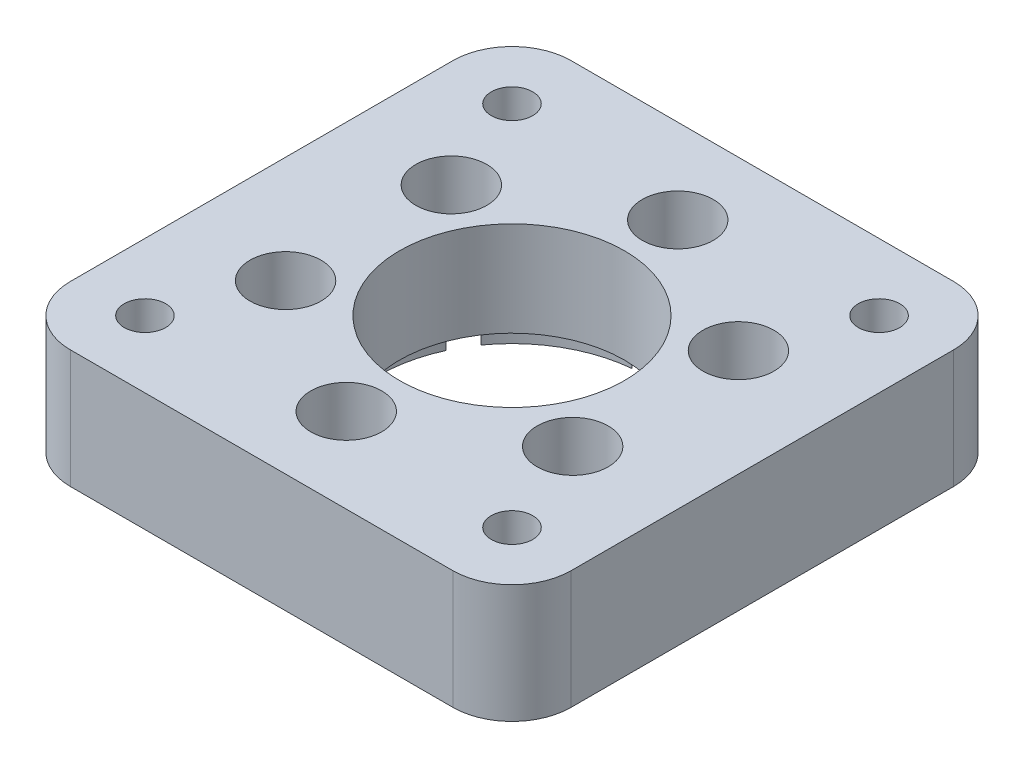
ISO-10303-21;
HEADER;
FILE_DESCRIPTION(('STEP AP214'),'2;1');
FILE_NAME('part.step','',(''),(''),'','','');
FILE_SCHEMA(('AUTOMOTIVE_DESIGN { 1 0 10303 214 1 1 1 1 }'));
ENDSEC;
DATA;
#1=APPLICATION_CONTEXT('core data for automotive mechanical design processes');
#2=APPLICATION_PROTOCOL_DEFINITION('international standard','automotive_design',2000,#1);
#3=PRODUCT_CONTEXT('',#1,'mechanical');
#4=PRODUCT('Part','Part','',(#3));
#5=PRODUCT_RELATED_PRODUCT_CATEGORY('part','',(#4));
#6=PRODUCT_DEFINITION_FORMATION('','',#4);
#7=PRODUCT_DEFINITION_CONTEXT('part definition',#1,'design');
#8=PRODUCT_DEFINITION('design','',#6,#7);
#9=PRODUCT_DEFINITION_SHAPE('','',#8);
#10=(LENGTH_UNIT() NAMED_UNIT(*) SI_UNIT(.MILLI.,.METRE.));
#11=(NAMED_UNIT(*) PLANE_ANGLE_UNIT() SI_UNIT($,.RADIAN.));
#12=(NAMED_UNIT(*) SI_UNIT($,.STERADIAN.) SOLID_ANGLE_UNIT());
#13=UNCERTAINTY_MEASURE_WITH_UNIT(LENGTH_MEASURE(1.E-05),#10,'distance_accuracy_value','');
#14=(GEOMETRIC_REPRESENTATION_CONTEXT(3) GLOBAL_UNCERTAINTY_ASSIGNED_CONTEXT((#13)) GLOBAL_UNIT_ASSIGNED_CONTEXT((#10,
#11,#12)) REPRESENTATION_CONTEXT('',''));
#15=CARTESIAN_POINT('',(0.,0.,0.));
#16=DIRECTION('',(0.,0.,1.));
#17=DIRECTION('',(1.,0.,0.));
#18=AXIS2_PLACEMENT_3D('',#15,#16,#17);
#19=CARTESIAN_POINT('',(0.,-3.,0.));
#20=DIRECTION('',(0.,-1.,0.));
#21=DIRECTION('',(0.,0.,-1.));
#22=AXIS2_PLACEMENT_3D('',#19,#20,#21);
#23=CYLINDRICAL_SURFACE('',#22,11.25);
#24=CARTESIAN_POINT('',(0.,-3.,0.));
#25=DIRECTION('',(0.,-1.,0.));
#26=DIRECTION('',(0.,0.,-1.));
#27=AXIS2_PLACEMENT_3D('',#24,#25,#26);
#28=CIRCLE('',#27,11.25);
#29=CARTESIAN_POINT('',(-9.16155232079619,-3.,-6.52904733275185));
#30=VERTEX_POINT('',#29);
#31=CARTESIAN_POINT('',(-1.07354469227591,-3.,-11.1986607142857));
#32=VERTEX_POINT('',#31);
#33=EDGE_CURVE('E184',#30,#32,#28,.T.);
#34=ORIENTED_EDGE('',*,*,#33,.F.);
#35=DIRECTION('',(0.,1.,0.));
#36=VECTOR('',#35,1.);
#37=CARTESIAN_POINT('',(-9.16155232079618,0.,-6.52904733275185));
#38=LINE('',#37,#36);
#39=CARTESIAN_POINT('',(-9.16155232079619,-5.,-6.52904733275185));
#40=VERTEX_POINT('',#39);
#41=EDGE_CURVE('E49',#30,#40,#38,.F.);
#42=ORIENTED_EDGE('',*,*,#41,.T.);
#43=CARTESIAN_POINT('',(0.,-5.,0.));
#44=DIRECTION('',(0.,-1.,0.));
#45=DIRECTION('',(0.,0.,-1.));
#46=AXIS2_PLACEMENT_3D('',#43,#44,#45);
#47=CIRCLE('',#46,11.25);
#48=CARTESIAN_POINT('',(-1.07354469227591,-5.,-11.1986607142857));
#49=VERTEX_POINT('',#48);
#50=EDGE_CURVE('E182',#40,#49,#47,.T.);
#51=ORIENTED_EDGE('',*,*,#50,.T.);
#52=DIRECTION('',(0.,1.,0.));
#53=VECTOR('',#52,1.);
#54=CARTESIAN_POINT('',(-1.07354469227591,0.,-11.1986607142857));
#55=LINE('',#54,#53);
#56=EDGE_CURVE('E270',#49,#32,#55,.T.);
#57=ORIENTED_EDGE('',*,*,#56,.T.);
#58=EDGE_LOOP('',(#34,#42,#51,#57));
#59=FACE_BOUND('',#58,.T.);
#60=ADVANCED_FACE('F35',(#59),#23,.F.);
#61=CARTESIAN_POINT('',(-10.2350970130722,-5.,4.66961338153388));
#62=VERTEX_POINT('',#61);
#63=CARTESIAN_POINT('',(-10.2350970130721,-5.,-4.66961338153409));
#64=VERTEX_POINT('',#63);
#65=EDGE_CURVE('E192',#62,#64,#47,.T.);
#66=ORIENTED_EDGE('',*,*,#65,.T.);
#67=DIRECTION('',(0.,1.,0.));
#68=VECTOR('',#67,1.);
#69=CARTESIAN_POINT('',(-10.2350970130721,0.,-4.66961338153409));
#70=LINE('',#69,#68);
#71=CARTESIAN_POINT('',(-10.2350970130721,-3.,-4.66961338153409));
#72=VERTEX_POINT('',#71);
#73=EDGE_CURVE('E172',#64,#72,#70,.T.);
#74=ORIENTED_EDGE('',*,*,#73,.T.);
#75=CARTESIAN_POINT('',(-10.2350970130722,-3.,4.66961338153388));
#76=VERTEX_POINT('',#75);
#77=EDGE_CURVE('E207',#76,#72,#28,.T.);
#78=ORIENTED_EDGE('',*,*,#77,.F.);
#79=DIRECTION('',(0.,1.,0.));
#80=VECTOR('',#79,1.);
#81=CARTESIAN_POINT('',(-10.2350970130722,0.,4.66961338153388));
#82=LINE('',#81,#80);
#83=EDGE_CURVE('E57',#76,#62,#82,.F.);
#84=ORIENTED_EDGE('',*,*,#83,.T.);
#85=EDGE_LOOP('',(#66,#74,#78,#84));
#86=FACE_BOUND('',#85,.T.);
#87=ADVANCED_FACE('F300',(#86),#23,.F.);
#88=CARTESIAN_POINT('',(-1.07354469227591,-5.,11.1986607142857));
#89=VERTEX_POINT('',#88);
#90=CARTESIAN_POINT('',(-9.16155232079632,-5.,6.52904733275166));
#91=VERTEX_POINT('',#90);
#92=EDGE_CURVE('E196',#89,#91,#47,.T.);
#93=ORIENTED_EDGE('',*,*,#92,.T.);
#94=DIRECTION('',(0.,1.,0.));
#95=VECTOR('',#94,1.);
#96=CARTESIAN_POINT('',(-9.16155232079632,0.,6.52904733275166));
#97=LINE('',#96,#95);
#98=CARTESIAN_POINT('',(-9.16155232079632,-3.,6.52904733275166));
#99=VERTEX_POINT('',#98);
#100=EDGE_CURVE('E227',#91,#99,#97,.T.);
#101=ORIENTED_EDGE('',*,*,#100,.T.);
#102=CARTESIAN_POINT('',(-1.07354469227591,-3.,11.1986607142857));
#103=VERTEX_POINT('',#102);
#104=EDGE_CURVE('E292',#103,#99,#28,.T.);
#105=ORIENTED_EDGE('',*,*,#104,.F.);
#106=DIRECTION('',(0.,1.,0.));
#107=VECTOR('',#106,1.);
#108=CARTESIAN_POINT('',(-1.07354469227591,0.,11.1986607142857));
#109=LINE('',#108,#107);
#110=EDGE_CURVE('E229',#103,#89,#109,.F.);
#111=ORIENTED_EDGE('',*,*,#110,.T.);
#112=EDGE_LOOP('',(#93,#101,#105,#111));
#113=FACE_BOUND('',#112,.T.);
#114=ADVANCED_FACE('F225',(#113),#23,.F.);
#115=CARTESIAN_POINT('',(9.16155232079623,-5.,6.52904733275177));
#116=VERTEX_POINT('',#115);
#117=CARTESIAN_POINT('',(1.07354469227591,-5.,11.1986607142857));
#118=VERTEX_POINT('',#117);
#119=EDGE_CURVE('E210',#116,#118,#47,.T.);
#120=ORIENTED_EDGE('',*,*,#119,.T.);
#121=DIRECTION('',(0.,1.,0.));
#122=VECTOR('',#121,1.);
#123=CARTESIAN_POINT('',(1.07354469227591,0.,11.1986607142857));
#124=LINE('',#123,#122);
#125=CARTESIAN_POINT('',(1.07354469227591,-3.,11.1986607142857));
#126=VERTEX_POINT('',#125);
#127=EDGE_CURVE('E243',#118,#126,#124,.T.);
#128=ORIENTED_EDGE('',*,*,#127,.T.);
#129=CARTESIAN_POINT('',(9.16155232079624,-3.,6.52904733275177));
#130=VERTEX_POINT('',#129);
#131=EDGE_CURVE('E288',#130,#126,#28,.T.);
#132=ORIENTED_EDGE('',*,*,#131,.F.);
#133=DIRECTION('',(0.,1.,0.));
#134=VECTOR('',#133,1.);
#135=CARTESIAN_POINT('',(9.16155232079623,0.,6.52904733275177));
#136=LINE('',#135,#134);
#137=EDGE_CURVE('E256',#130,#116,#136,.F.);
#138=ORIENTED_EDGE('',*,*,#137,.T.);
#139=EDGE_LOOP('',(#120,#128,#132,#138));
#140=FACE_BOUND('',#139,.T.);
#141=ADVANCED_FACE('F417',(#140),#23,.F.);
#142=CARTESIAN_POINT('',(10.2350970130722,-5.,-4.66961338153395));
#143=VERTEX_POINT('',#142);
#144=CARTESIAN_POINT('',(10.2350970130721,-5.,4.66961338153403));
#145=VERTEX_POINT('',#144);
#146=EDGE_CURVE('E203',#143,#145,#47,.T.);
#147=ORIENTED_EDGE('',*,*,#146,.T.);
#148=DIRECTION('',(0.,1.,0.));
#149=VECTOR('',#148,1.);
#150=CARTESIAN_POINT('',(10.2350970130721,0.,4.66961338153403));
#151=LINE('',#150,#149);
#152=CARTESIAN_POINT('',(10.2350970130721,-3.,4.66961338153403));
#153=VERTEX_POINT('',#152);
#154=EDGE_CURVE('E252',#145,#153,#151,.T.);
#155=ORIENTED_EDGE('',*,*,#154,.T.);
#156=CARTESIAN_POINT('',(10.2350970130722,-3.,-4.66961338153395));
#157=VERTEX_POINT('',#156);
#158=EDGE_CURVE('E279',#157,#153,#28,.T.);
#159=ORIENTED_EDGE('',*,*,#158,.F.);
#160=DIRECTION('',(0.,1.,0.));
#161=VECTOR('',#160,1.);
#162=CARTESIAN_POINT('',(10.2350970130722,0.,-4.66961338153395));
#163=LINE('',#162,#161);
#164=EDGE_CURVE('E266',#157,#143,#163,.F.);
#165=ORIENTED_EDGE('',*,*,#164,.T.);
#166=EDGE_LOOP('',(#147,#155,#159,#165));
#167=FACE_BOUND('',#166,.T.);
#168=ADVANCED_FACE('F407',(#167),#23,.F.);
#169=CARTESIAN_POINT('',(21.15,5.,-21.15));
#170=DIRECTION('',(-1.,0.,0.));
#171=DIRECTION('',(0.,0.,1.));
#172=AXIS2_PLACEMENT_3D('',#169,#170,#171);
#173=PLANE('',#172);
#174=DIRECTION('',(0.,0.,-1.));
#175=VECTOR('',#174,1.);
#176=CARTESIAN_POINT('',(21.15,-5.,-21.15));
#177=LINE('',#176,#175);
#178=CARTESIAN_POINT('',(21.15,-5.,16.15));
#179=VERTEX_POINT('',#178);
#180=CARTESIAN_POINT('',(21.15,-5.,-16.15));
#181=VERTEX_POINT('',#180);
#182=EDGE_CURVE('E645',#179,#181,#177,.T.);
#183=ORIENTED_EDGE('',*,*,#182,.T.);
#184=DIRECTION('',(0.,-1.,0.));
#185=VECTOR('',#184,1.);
#186=CARTESIAN_POINT('',(21.15,5.,-16.15));
#187=LINE('',#186,#185);
#188=CARTESIAN_POINT('',(21.15,5.,-16.15));
#189=VERTEX_POINT('',#188);
#190=EDGE_CURVE('E374',#181,#189,#187,.F.);
#191=ORIENTED_EDGE('',*,*,#190,.T.);
#192=DIRECTION('',(0.,0.,-1.));
#193=VECTOR('',#192,1.);
#194=CARTESIAN_POINT('',(21.15,5.,-21.15));
#195=LINE('',#194,#193);
#196=CARTESIAN_POINT('',(21.15,5.,16.15));
#197=VERTEX_POINT('',#196);
#198=EDGE_CURVE('E661',#197,#189,#195,.T.);
#199=ORIENTED_EDGE('',*,*,#198,.F.);
#200=DIRECTION('',(0.,-1.,0.));
#201=VECTOR('',#200,1.);
#202=CARTESIAN_POINT('',(21.15,5.,16.15));
#203=LINE('',#202,#201);
#204=EDGE_CURVE('E371',#197,#179,#203,.T.);
#205=ORIENTED_EDGE('',*,*,#204,.T.);
#206=EDGE_LOOP('',(#183,#191,#199,#205));
#207=FACE_BOUND('',#206,.T.);
#208=ADVANCED_FACE('F416',(#207),#173,.F.);
#209=CARTESIAN_POINT('',(-21.15,5.,-21.15));
#210=DIRECTION('',(0.,0.,1.));
#211=DIRECTION('',(1.,0.,0.));
#212=AXIS2_PLACEMENT_3D('',#209,#210,#211);
#213=PLANE('',#212);
#214=DIRECTION('',(-1.,0.,0.));
#215=VECTOR('',#214,1.);
#216=CARTESIAN_POINT('',(-21.15,-5.,-21.15));
#217=LINE('',#216,#215);
#218=CARTESIAN_POINT('',(16.15,-5.,-21.15));
#219=VERTEX_POINT('',#218);
#220=CARTESIAN_POINT('',(-16.15,-5.,-21.15));
#221=VERTEX_POINT('',#220);
#222=EDGE_CURVE('E639',#219,#221,#217,.T.);
#223=ORIENTED_EDGE('',*,*,#222,.T.);
#224=DIRECTION('',(0.,-1.,0.));
#225=VECTOR('',#224,1.);
#226=CARTESIAN_POINT('',(-16.15,5.,-21.15));
#227=LINE('',#226,#225);
#228=CARTESIAN_POINT('',(-16.15,5.,-21.15));
#229=VERTEX_POINT('',#228);
#230=EDGE_CURVE('E364',#221,#229,#227,.F.);
#231=ORIENTED_EDGE('',*,*,#230,.T.);
#232=DIRECTION('',(-1.,0.,0.));
#233=VECTOR('',#232,1.);
#234=CARTESIAN_POINT('',(-21.15,5.,-21.15));
#235=LINE('',#234,#233);
#236=CARTESIAN_POINT('',(16.15,5.,-21.15));
#237=VERTEX_POINT('',#236);
#238=EDGE_CURVE('E352',#237,#229,#235,.T.);
#239=ORIENTED_EDGE('',*,*,#238,.F.);
#240=DIRECTION('',(0.,-1.,0.));
#241=VECTOR('',#240,1.);
#242=CARTESIAN_POINT('',(16.15,5.,-21.15));
#243=LINE('',#242,#241);
#244=EDGE_CURVE('E361',#237,#219,#243,.T.);
#245=ORIENTED_EDGE('',*,*,#244,.T.);
#246=EDGE_LOOP('',(#223,#231,#239,#245));
#247=FACE_BOUND('',#246,.T.);
#248=ADVANCED_FACE('F422',(#247),#213,.F.);
#249=CARTESIAN_POINT('',(-21.15,5.,-21.15));
#250=DIRECTION('',(1.,0.,0.));
#251=DIRECTION('',(0.,0.,-1.));
#252=AXIS2_PLACEMENT_3D('',#249,#250,#251);
#253=PLANE('',#252);
#254=DIRECTION('',(0.,0.,1.));
#255=VECTOR('',#254,1.);
#256=CARTESIAN_POINT('',(-21.15,-5.,-21.15));
#257=LINE('',#256,#255);
#258=CARTESIAN_POINT('',(-21.15,-5.,-16.15));
#259=VERTEX_POINT('',#258);
#260=CARTESIAN_POINT('',(-21.15,-5.,16.15));
#261=VERTEX_POINT('',#260);
#262=EDGE_CURVE('E644',#259,#261,#257,.T.);
#263=ORIENTED_EDGE('',*,*,#262,.T.);
#264=DIRECTION('',(0.,-1.,0.));
#265=VECTOR('',#264,1.);
#266=CARTESIAN_POINT('',(-21.15,5.,16.15));
#267=LINE('',#266,#265);
#268=CARTESIAN_POINT('',(-21.15,5.,16.15));
#269=VERTEX_POINT('',#268);
#270=EDGE_CURVE('E358',#261,#269,#267,.F.);
#271=ORIENTED_EDGE('',*,*,#270,.T.);
#272=DIRECTION('',(0.,0.,1.));
#273=VECTOR('',#272,1.);
#274=CARTESIAN_POINT('',(-21.15,5.,-21.15));
#275=LINE('',#274,#273);
#276=CARTESIAN_POINT('',(-21.15,5.,-16.15));
#277=VERTEX_POINT('',#276);
#278=EDGE_CURVE('E340',#277,#269,#275,.T.);
#279=ORIENTED_EDGE('',*,*,#278,.F.);
#280=DIRECTION('',(0.,-1.,0.));
#281=VECTOR('',#280,1.);
#282=CARTESIAN_POINT('',(-21.15,5.,-16.15));
#283=LINE('',#282,#281);
#284=EDGE_CURVE('E648',#277,#259,#283,.T.);
#285=ORIENTED_EDGE('',*,*,#284,.T.);
#286=EDGE_LOOP('',(#263,#271,#279,#285));
#287=FACE_BOUND('',#286,.T.);
#288=ADVANCED_FACE('F544',(#287),#253,.F.);
#289=CARTESIAN_POINT('',(-21.15,5.,21.15));
#290=DIRECTION('',(0.,0.,-1.));
#291=DIRECTION('',(-1.,0.,0.));
#292=AXIS2_PLACEMENT_3D('',#289,#290,#291);
#293=PLANE('',#292);
#294=DIRECTION('',(1.,0.,0.));
#295=VECTOR('',#294,1.);
#296=CARTESIAN_POINT('',(-21.15,5.,21.15));
#297=LINE('',#296,#295);
#298=CARTESIAN_POINT('',(-16.15,5.,21.15));
#299=VERTEX_POINT('',#298);
#300=CARTESIAN_POINT('',(16.15,5.,21.15));
#301=VERTEX_POINT('',#300);
#302=EDGE_CURVE('E351',#299,#301,#297,.T.);
#303=ORIENTED_EDGE('',*,*,#302,.F.);
#304=DIRECTION('',(0.,-1.,0.));
#305=VECTOR('',#304,1.);
#306=CARTESIAN_POINT('',(-16.15,5.,21.15));
#307=LINE('',#306,#305);
#308=CARTESIAN_POINT('',(-16.15,-5.,21.15));
#309=VERTEX_POINT('',#308);
#310=EDGE_CURVE('E360',#299,#309,#307,.T.);
#311=ORIENTED_EDGE('',*,*,#310,.T.);
#312=DIRECTION('',(1.,0.,0.));
#313=VECTOR('',#312,1.);
#314=CARTESIAN_POINT('',(-21.15,-5.,21.15));
#315=LINE('',#314,#313);
#316=CARTESIAN_POINT('',(16.15,-5.,21.15));
#317=VERTEX_POINT('',#316);
#318=EDGE_CURVE('E674',#309,#317,#315,.T.);
#319=ORIENTED_EDGE('',*,*,#318,.T.);
#320=DIRECTION('',(0.,-1.,0.));
#321=VECTOR('',#320,1.);
#322=CARTESIAN_POINT('',(16.15,5.,21.15));
#323=LINE('',#322,#321);
#324=EDGE_CURVE('E672',#317,#301,#323,.F.);
#325=ORIENTED_EDGE('',*,*,#324,.T.);
#326=EDGE_LOOP('',(#303,#311,#319,#325));
#327=FACE_BOUND('',#326,.T.);
#328=ADVANCED_FACE('F309',(#327),#293,.F.);
#329=CARTESIAN_POINT('',(0.,5.,0.));
#330=DIRECTION('',(0.,1.,0.));
#331=DIRECTION('',(0.,0.,1.));
#332=AXIS2_PLACEMENT_3D('',#329,#330,#331);
#333=PLANE('',#332);
#334=CARTESIAN_POINT('',(-12.1243556529821,5.,-7.00000000000014));
#335=DIRECTION('',(0.,1.,0.));
#336=DIRECTION('',(0.866025403784433,0.,0.50000000000001));
#337=AXIS2_PLACEMENT_3D('',#334,#335,#336);
#338=CIRCLE('',#337,3.);
#339=CARTESIAN_POINT('',(-9.52627944162876,5.,-5.50000000000011));
#340=VERTEX_POINT('',#339);
#341=EDGE_CURVE('E177',#340,#340,#338,.T.);
#342=ORIENTED_EDGE('',*,*,#341,.F.);
#343=EDGE_LOOP('',(#342));
#344=FACE_BOUND('',#343,.T.);
#345=CARTESIAN_POINT('',(-12.1243556529822,5.,6.99999999999989));
#346=DIRECTION('',(0.,1.,0.));
#347=DIRECTION('',(0.866025403784443,0.,-0.499999999999992));
#348=AXIS2_PLACEMENT_3D('',#345,#346,#347);
#349=CIRCLE('',#348,3.);
#350=CARTESIAN_POINT('',(-9.52627944162888,5.,5.49999999999991));
#351=VERTEX_POINT('',#350);
#352=EDGE_CURVE('E185',#351,#351,#349,.T.);
#353=ORIENTED_EDGE('',*,*,#352,.F.);
#354=EDGE_LOOP('',(#353));
#355=FACE_BOUND('',#354,.T.);
#356=CARTESIAN_POINT('',(0.,5.,14.));
#357=DIRECTION('',(0.,1.,0.));
#358=DIRECTION('',(0.,0.,-1.));
#359=AXIS2_PLACEMENT_3D('',#356,#357,#358);
#360=CIRCLE('',#359,3.);
#361=CARTESIAN_POINT('',(0.,5.,11.));
#362=VERTEX_POINT('',#361);
#363=EDGE_CURVE('E241',#362,#362,#360,.T.);
#364=ORIENTED_EDGE('',*,*,#363,.F.);
#365=EDGE_LOOP('',(#364));
#366=FACE_BOUND('',#365,.T.);
#367=CARTESIAN_POINT('',(12.1243556529821,5.,7.00000000000006));
#368=DIRECTION('',(0.,1.,0.));
#369=DIRECTION('',(-0.866025403784436,0.,-0.500000000000004));
#370=AXIS2_PLACEMENT_3D('',#367,#368,#369);
#371=CIRCLE('',#370,3.);
#372=CARTESIAN_POINT('',(9.5262794416288,5.,5.50000000000004));
#373=VERTEX_POINT('',#372);
#374=EDGE_CURVE('E248',#373,#373,#371,.T.);
#375=ORIENTED_EDGE('',*,*,#374,.F.);
#376=EDGE_LOOP('',(#375));
#377=FACE_BOUND('',#376,.T.);
#378=CARTESIAN_POINT('',(12.1243556529822,5.,-6.99999999999997));
#379=DIRECTION('',(0.,1.,0.));
#380=DIRECTION('',(-0.86602540378444,0.,0.499999999999998));
#381=AXIS2_PLACEMENT_3D('',#378,#379,#380);
#382=CIRCLE('',#381,3.);
#383=CARTESIAN_POINT('',(9.52627944162884,5.,-5.49999999999998));
#384=VERTEX_POINT('',#383);
#385=EDGE_CURVE('E258',#384,#384,#382,.T.);
#386=ORIENTED_EDGE('',*,*,#385,.F.);
#387=EDGE_LOOP('',(#386));
#388=FACE_BOUND('',#387,.T.);
#389=CARTESIAN_POINT('',(0.,5.,-14.));
#390=DIRECTION('',(0.,1.,0.));
#391=DIRECTION('',(0.,0.,1.));
#392=AXIS2_PLACEMENT_3D('',#389,#390,#391);
#393=CIRCLE('',#392,3.);
#394=CARTESIAN_POINT('',(0.,5.,-11.));
#395=VERTEX_POINT('',#394);
#396=EDGE_CURVE('E268',#395,#395,#393,.T.);
#397=ORIENTED_EDGE('',*,*,#396,.F.);
#398=EDGE_LOOP('',(#397));
#399=FACE_BOUND('',#398,.T.);
#400=CARTESIAN_POINT('',(0.,5.,0.));
#401=DIRECTION('',(0.,-1.,0.));
#402=DIRECTION('',(0.,0.,-1.));
#403=AXIS2_PLACEMENT_3D('',#400,#401,#402);
#404=CIRCLE('',#403,9.5);
#405=CARTESIAN_POINT('',(0.,5.,-9.5));
#406=VERTEX_POINT('',#405);
#407=EDGE_CURVE('E193',#406,#406,#404,.T.);
#408=ORIENTED_EDGE('',*,*,#407,.T.);
#409=EDGE_LOOP('',(#408));
#410=FACE_BOUND('',#409,.T.);
#411=CARTESIAN_POINT('',(-15.5,5.,-15.5));
#412=DIRECTION('',(0.,-1.,0.));
#413=DIRECTION('',(0.,0.,-1.));
#414=AXIS2_PLACEMENT_3D('',#411,#412,#413);
#415=CIRCLE('',#414,1.75);
#416=CARTESIAN_POINT('',(-15.5,5.,-17.25));
#417=VERTEX_POINT('',#416);
#418=EDGE_CURVE('E285',#417,#417,#415,.T.);
#419=ORIENTED_EDGE('',*,*,#418,.T.);
#420=EDGE_LOOP('',(#419));
#421=FACE_BOUND('',#420,.T.);
#422=CARTESIAN_POINT('',(15.5,5.,-15.5));
#423=DIRECTION('',(0.,-1.,0.));
#424=DIRECTION('',(0.,0.,-1.));
#425=AXIS2_PLACEMENT_3D('',#422,#423,#424);
#426=CIRCLE('',#425,1.75);
#427=CARTESIAN_POINT('',(15.5,5.,-17.25));
#428=VERTEX_POINT('',#427);
#429=EDGE_CURVE('E329',#428,#428,#426,.T.);
#430=ORIENTED_EDGE('',*,*,#429,.T.);
#431=EDGE_LOOP('',(#430));
#432=FACE_BOUND('',#431,.T.);
#433=CARTESIAN_POINT('',(15.5,5.,15.5));
#434=DIRECTION('',(0.,-1.,0.));
#435=DIRECTION('',(0.,0.,-1.));
#436=AXIS2_PLACEMENT_3D('',#433,#434,#435);
#437=CIRCLE('',#436,1.75);
#438=CARTESIAN_POINT('',(15.5,5.,13.75));
#439=VERTEX_POINT('',#438);
#440=EDGE_CURVE('E333',#439,#439,#437,.T.);
#441=ORIENTED_EDGE('',*,*,#440,.T.);
#442=EDGE_LOOP('',(#441));
#443=FACE_BOUND('',#442,.T.);
#444=CARTESIAN_POINT('',(-15.5,5.,15.5));
#445=DIRECTION('',(0.,-1.,0.));
#446=DIRECTION('',(0.,0.,-1.));
#447=AXIS2_PLACEMENT_3D('',#444,#445,#446);
#448=CIRCLE('',#447,1.75);
#449=CARTESIAN_POINT('',(-15.5,5.,13.75));
#450=VERTEX_POINT('',#449);
#451=EDGE_CURVE('E337',#450,#450,#448,.T.);
#452=ORIENTED_EDGE('',*,*,#451,.T.);
#453=EDGE_LOOP('',(#452));
#454=FACE_BOUND('',#453,.T.);
#455=ORIENTED_EDGE('',*,*,#278,.T.);
#456=CARTESIAN_POINT('',(-16.15,5.,16.15));
#457=DIRECTION('',(0.,1.,0.));
#458=DIRECTION('',(0.,0.,1.));
#459=AXIS2_PLACEMENT_3D('',#456,#457,#458);
#460=CIRCLE('',#459,5.);
#461=EDGE_CURVE('E343',#269,#299,#460,.T.);
#462=ORIENTED_EDGE('',*,*,#461,.T.);
#463=ORIENTED_EDGE('',*,*,#302,.T.);
#464=CARTESIAN_POINT('',(16.15,5.,16.15));
#465=DIRECTION('',(0.,1.,0.));
#466=DIRECTION('',(0.,0.,1.));
#467=AXIS2_PLACEMENT_3D('',#464,#465,#466);
#468=CIRCLE('',#467,5.);
#469=EDGE_CURVE('E653',#301,#197,#468,.T.);
#470=ORIENTED_EDGE('',*,*,#469,.T.);
#471=ORIENTED_EDGE('',*,*,#198,.T.);
#472=CARTESIAN_POINT('',(16.15,5.,-16.15));
#473=DIRECTION('',(0.,1.,0.));
#474=DIRECTION('',(0.,0.,1.));
#475=AXIS2_PLACEMENT_3D('',#472,#473,#474);
#476=CIRCLE('',#475,5.);
#477=EDGE_CURVE('E366',#189,#237,#476,.T.);
#478=ORIENTED_EDGE('',*,*,#477,.T.);
#479=ORIENTED_EDGE('',*,*,#238,.T.);
#480=CARTESIAN_POINT('',(-16.15,5.,-16.15));
#481=DIRECTION('',(0.,1.,0.));
#482=DIRECTION('',(0.,0.,1.));
#483=AXIS2_PLACEMENT_3D('',#480,#481,#482);
#484=CIRCLE('',#483,5.);
#485=EDGE_CURVE('E347',#229,#277,#484,.T.);
#486=ORIENTED_EDGE('',*,*,#485,.T.);
#487=EDGE_LOOP('',(#455,#462,#463,#470,#471,#478,#479,#486));
#488=FACE_BOUND('',#487,.T.);
#489=ADVANCED_FACE('F306',(#344,#355,#366,#377,#388,#399,#410,#421,#432,#443,#454,#488),#333,.T.);
#490=CARTESIAN_POINT('',(0.,-5.,0.));
#491=DIRECTION('',(0.,1.,0.));
#492=DIRECTION('',(0.,0.,1.));
#493=AXIS2_PLACEMENT_3D('',#490,#491,#492);
#494=PLANE('',#493);
#495=ORIENTED_EDGE('',*,*,#50,.F.);
#496=CARTESIAN_POINT('',(-12.1243556529821,-5.,-7.00000000000014));
#497=DIRECTION('',(0.,1.,0.));
#498=DIRECTION('',(0.866025403784433,0.,0.50000000000001));
#499=AXIS2_PLACEMENT_3D('',#496,#497,#498);
#500=CIRCLE('',#499,3.);
#501=EDGE_CURVE('E169',#40,#64,#500,.T.);
#502=ORIENTED_EDGE('',*,*,#501,.T.);
#503=ORIENTED_EDGE('',*,*,#65,.F.);
#504=CARTESIAN_POINT('',(-12.1243556529822,-5.,6.99999999999989));
#505=DIRECTION('',(0.,1.,0.));
#506=DIRECTION('',(0.866025403784443,0.,-0.499999999999992));
#507=AXIS2_PLACEMENT_3D('',#504,#505,#506);
#508=CIRCLE('',#507,3.);
#509=EDGE_CURVE('E233',#62,#91,#508,.T.);
#510=ORIENTED_EDGE('',*,*,#509,.T.);
#511=ORIENTED_EDGE('',*,*,#92,.F.);
#512=CARTESIAN_POINT('',(0.,-5.,14.));
#513=DIRECTION('',(0.,1.,0.));
#514=DIRECTION('',(0.,0.,-1.));
#515=AXIS2_PLACEMENT_3D('',#512,#513,#514);
#516=CIRCLE('',#515,3.);
#517=EDGE_CURVE('E232',#89,#118,#516,.T.);
#518=ORIENTED_EDGE('',*,*,#517,.T.);
#519=ORIENTED_EDGE('',*,*,#119,.F.);
#520=CARTESIAN_POINT('',(12.1243556529821,-5.,7.00000000000006));
#521=DIRECTION('',(0.,1.,0.));
#522=DIRECTION('',(-0.866025403784436,0.,-0.500000000000004));
#523=AXIS2_PLACEMENT_3D('',#520,#521,#522);
#524=CIRCLE('',#523,3.);
#525=EDGE_CURVE('E249',#116,#145,#524,.T.);
#526=ORIENTED_EDGE('',*,*,#525,.T.);
#527=ORIENTED_EDGE('',*,*,#146,.F.);
#528=CARTESIAN_POINT('',(12.1243556529822,-5.,-6.99999999999997));
#529=DIRECTION('',(0.,1.,0.));
#530=DIRECTION('',(-0.86602540378444,0.,0.499999999999998));
#531=AXIS2_PLACEMENT_3D('',#528,#529,#530);
#532=CIRCLE('',#531,3.);
#533=CARTESIAN_POINT('',(9.16155232079628,-5.,-6.52904733275172));
#534=VERTEX_POINT('',#533);
#535=EDGE_CURVE('E259',#143,#534,#532,.T.);
#536=ORIENTED_EDGE('',*,*,#535,.T.);
#537=CARTESIAN_POINT('',(1.07354469227591,-5.,-11.1986607142857));
#538=VERTEX_POINT('',#537);
#539=EDGE_CURVE('E195',#538,#534,#47,.T.);
#540=ORIENTED_EDGE('',*,*,#539,.F.);
#541=CARTESIAN_POINT('',(0.,-5.,-14.));
#542=DIRECTION('',(0.,1.,0.));
#543=DIRECTION('',(0.,0.,1.));
#544=AXIS2_PLACEMENT_3D('',#541,#542,#543);
#545=CIRCLE('',#544,3.);
#546=EDGE_CURVE('E191',#538,#49,#545,.T.);
#547=ORIENTED_EDGE('',*,*,#546,.T.);
#548=EDGE_LOOP('',(#495,#502,#503,#510,#511,#518,#519,#526,#527,#536,#540,#547));
#549=FACE_BOUND('',#548,.T.);
#550=CARTESIAN_POINT('',(-15.5,-5.,-15.5));
#551=DIRECTION('',(0.,-1.,0.));
#552=DIRECTION('',(0.,0.,-1.));
#553=AXIS2_PLACEMENT_3D('',#550,#551,#552);
#554=CIRCLE('',#553,1.75);
#555=CARTESIAN_POINT('',(-15.5,-5.,-17.25));
#556=VERTEX_POINT('',#555);
#557=EDGE_CURVE('E278',#556,#556,#554,.T.);
#558=ORIENTED_EDGE('',*,*,#557,.F.);
#559=EDGE_LOOP('',(#558));
#560=FACE_BOUND('',#559,.T.);
#561=CARTESIAN_POINT('',(15.5,-5.,-15.5));
#562=DIRECTION('',(0.,-1.,0.));
#563=DIRECTION('',(0.,0.,-1.));
#564=AXIS2_PLACEMENT_3D('',#561,#562,#563);
#565=CIRCLE('',#564,1.75);
#566=CARTESIAN_POINT('',(15.5,-5.,-17.25));
#567=VERTEX_POINT('',#566);
#568=EDGE_CURVE('E689',#567,#567,#565,.T.);
#569=ORIENTED_EDGE('',*,*,#568,.F.);
#570=EDGE_LOOP('',(#569));
#571=FACE_BOUND('',#570,.T.);
#572=CARTESIAN_POINT('',(15.5,-5.,15.5));
#573=DIRECTION('',(0.,-1.,0.));
#574=DIRECTION('',(0.,0.,-1.));
#575=AXIS2_PLACEMENT_3D('',#572,#573,#574);
#576=CIRCLE('',#575,1.75);
#577=CARTESIAN_POINT('',(15.5,-5.,13.75));
#578=VERTEX_POINT('',#577);
#579=EDGE_CURVE('E685',#578,#578,#576,.T.);
#580=ORIENTED_EDGE('',*,*,#579,.F.);
#581=EDGE_LOOP('',(#580));
#582=FACE_BOUND('',#581,.T.);
#583=CARTESIAN_POINT('',(-15.5,-5.,15.5));
#584=DIRECTION('',(0.,-1.,0.));
#585=DIRECTION('',(0.,0.,-1.));
#586=AXIS2_PLACEMENT_3D('',#583,#584,#585);
#587=CIRCLE('',#586,1.75);
#588=CARTESIAN_POINT('',(-15.5,-5.,13.75));
#589=VERTEX_POINT('',#588);
#590=EDGE_CURVE('E681',#589,#589,#587,.T.);
#591=ORIENTED_EDGE('',*,*,#590,.F.);
#592=EDGE_LOOP('',(#591));
#593=FACE_BOUND('',#592,.T.);
#594=ORIENTED_EDGE('',*,*,#318,.F.);
#595=CARTESIAN_POINT('',(-16.15,-5.,16.15));
#596=DIRECTION('',(0.,1.,0.));
#597=DIRECTION('',(0.,0.,1.));
#598=AXIS2_PLACEMENT_3D('',#595,#596,#597);
#599=CIRCLE('',#598,5.);
#600=EDGE_CURVE('E651',#309,#261,#599,.F.);
#601=ORIENTED_EDGE('',*,*,#600,.T.);
#602=ORIENTED_EDGE('',*,*,#262,.F.);
#603=CARTESIAN_POINT('',(-16.15,-5.,-16.15));
#604=DIRECTION('',(0.,1.,0.));
#605=DIRECTION('',(0.,0.,1.));
#606=AXIS2_PLACEMENT_3D('',#603,#604,#605);
#607=CIRCLE('',#606,5.);
#608=EDGE_CURVE('E647',#259,#221,#607,.F.);
#609=ORIENTED_EDGE('',*,*,#608,.T.);
#610=ORIENTED_EDGE('',*,*,#222,.F.);
#611=CARTESIAN_POINT('',(16.15,-5.,-16.15));
#612=DIRECTION('',(0.,1.,0.));
#613=DIRECTION('',(0.,0.,1.));
#614=AXIS2_PLACEMENT_3D('',#611,#612,#613);
#615=CIRCLE('',#614,5.);
#616=EDGE_CURVE('E664',#219,#181,#615,.F.);
#617=ORIENTED_EDGE('',*,*,#616,.T.);
#618=ORIENTED_EDGE('',*,*,#182,.F.);
#619=CARTESIAN_POINT('',(16.15,-5.,16.15));
#620=DIRECTION('',(0.,1.,0.));
#621=DIRECTION('',(0.,0.,1.));
#622=AXIS2_PLACEMENT_3D('',#619,#620,#621);
#623=CIRCLE('',#622,5.);
#624=EDGE_CURVE('E667',#179,#317,#623,.F.);
#625=ORIENTED_EDGE('',*,*,#624,.T.);
#626=EDGE_LOOP('',(#594,#601,#602,#609,#610,#617,#618,#625));
#627=FACE_BOUND('',#626,.T.);
#628=ADVANCED_FACE('F188',(#549,#560,#571,#582,#593,#627),#494,.F.);
#629=CARTESIAN_POINT('',(-16.15,5.,16.15));
#630=DIRECTION('',(0.,-1.,0.));
#631=DIRECTION('',(0.,0.,-1.));
#632=AXIS2_PLACEMENT_3D('',#629,#630,#631);
#633=CYLINDRICAL_SURFACE('',#632,5.);
#634=ORIENTED_EDGE('',*,*,#461,.F.);
#635=ORIENTED_EDGE('',*,*,#270,.F.);
#636=ORIENTED_EDGE('',*,*,#600,.F.);
#637=ORIENTED_EDGE('',*,*,#310,.F.);
#638=EDGE_LOOP('',(#634,#635,#636,#637));
#639=FACE_BOUND('',#638,.T.);
#640=ADVANCED_FACE('F357',(#639),#633,.T.);
#641=CARTESIAN_POINT('',(-16.15,5.,-16.15));
#642=DIRECTION('',(0.,-1.,0.));
#643=DIRECTION('',(0.,0.,-1.));
#644=AXIS2_PLACEMENT_3D('',#641,#642,#643);
#645=CYLINDRICAL_SURFACE('',#644,5.);
#646=ORIENTED_EDGE('',*,*,#485,.F.);
#647=ORIENTED_EDGE('',*,*,#230,.F.);
#648=ORIENTED_EDGE('',*,*,#608,.F.);
#649=ORIENTED_EDGE('',*,*,#284,.F.);
#650=EDGE_LOOP('',(#646,#647,#648,#649));
#651=FACE_BOUND('',#650,.T.);
#652=ADVANCED_FACE('F516',(#651),#645,.T.);
#653=CARTESIAN_POINT('',(16.15,5.,-16.15));
#654=DIRECTION('',(0.,-1.,0.));
#655=DIRECTION('',(0.,0.,-1.));
#656=AXIS2_PLACEMENT_3D('',#653,#654,#655);
#657=CYLINDRICAL_SURFACE('',#656,5.);
#658=ORIENTED_EDGE('',*,*,#477,.F.);
#659=ORIENTED_EDGE('',*,*,#190,.F.);
#660=ORIENTED_EDGE('',*,*,#616,.F.);
#661=ORIENTED_EDGE('',*,*,#244,.F.);
#662=EDGE_LOOP('',(#658,#659,#660,#661));
#663=FACE_BOUND('',#662,.T.);
#664=ADVANCED_FACE('F507',(#663),#657,.T.);
#665=CARTESIAN_POINT('',(16.15,5.,16.15));
#666=DIRECTION('',(0.,-1.,0.));
#667=DIRECTION('',(0.,0.,-1.));
#668=AXIS2_PLACEMENT_3D('',#665,#666,#667);
#669=CYLINDRICAL_SURFACE('',#668,5.);
#670=ORIENTED_EDGE('',*,*,#469,.F.);
#671=ORIENTED_EDGE('',*,*,#324,.F.);
#672=ORIENTED_EDGE('',*,*,#624,.F.);
#673=ORIENTED_EDGE('',*,*,#204,.F.);
#674=EDGE_LOOP('',(#670,#671,#672,#673));
#675=FACE_BOUND('',#674,.T.);
#676=ADVANCED_FACE('F37',(#675),#669,.T.);
#677=CARTESIAN_POINT('',(-15.5,5.,15.5));
#678=DIRECTION('',(0.,-1.,0.));
#679=DIRECTION('',(0.,0.,-1.));
#680=AXIS2_PLACEMENT_3D('',#677,#678,#679);
#681=CYLINDRICAL_SURFACE('',#680,1.75);
#682=ORIENTED_EDGE('',*,*,#451,.F.);
#683=EDGE_LOOP('',(#682));
#684=FACE_BOUND('',#683,.T.);
#685=ORIENTED_EDGE('',*,*,#590,.T.);
#686=EDGE_LOOP('',(#685));
#687=FACE_BOUND('',#686,.T.);
#688=ADVANCED_FACE('F488',(#684,#687),#681,.F.);
#689=CARTESIAN_POINT('',(15.5,5.,15.5));
#690=DIRECTION('',(0.,-1.,0.));
#691=DIRECTION('',(0.,0.,-1.));
#692=AXIS2_PLACEMENT_3D('',#689,#690,#691);
#693=CYLINDRICAL_SURFACE('',#692,1.75);
#694=ORIENTED_EDGE('',*,*,#440,.F.);
#695=EDGE_LOOP('',(#694));
#696=FACE_BOUND('',#695,.T.);
#697=ORIENTED_EDGE('',*,*,#579,.T.);
#698=EDGE_LOOP('',(#697));
#699=FACE_BOUND('',#698,.T.);
#700=ADVANCED_FACE('F478',(#696,#699),#693,.F.);
#701=CARTESIAN_POINT('',(15.5,5.,-15.5));
#702=DIRECTION('',(0.,-1.,0.));
#703=DIRECTION('',(0.,0.,-1.));
#704=AXIS2_PLACEMENT_3D('',#701,#702,#703);
#705=CYLINDRICAL_SURFACE('',#704,1.75);
#706=ORIENTED_EDGE('',*,*,#429,.F.);
#707=EDGE_LOOP('',(#706));
#708=FACE_BOUND('',#707,.T.);
#709=ORIENTED_EDGE('',*,*,#568,.T.);
#710=EDGE_LOOP('',(#709));
#711=FACE_BOUND('',#710,.T.);
#712=ADVANCED_FACE('F413',(#708,#711),#705,.F.);
#713=CARTESIAN_POINT('',(-15.5,5.,-15.5));
#714=DIRECTION('',(0.,-1.,0.));
#715=DIRECTION('',(0.,0.,-1.));
#716=AXIS2_PLACEMENT_3D('',#713,#714,#715);
#717=CYLINDRICAL_SURFACE('',#716,1.75);
#718=ORIENTED_EDGE('',*,*,#418,.F.);
#719=EDGE_LOOP('',(#718));
#720=FACE_BOUND('',#719,.T.);
#721=ORIENTED_EDGE('',*,*,#557,.T.);
#722=EDGE_LOOP('',(#721));
#723=FACE_BOUND('',#722,.T.);
#724=ADVANCED_FACE('F406',(#720,#723),#717,.F.);
#725=ORIENTED_EDGE('',*,*,#539,.T.);
#726=DIRECTION('',(0.,1.,0.));
#727=VECTOR('',#726,1.);
#728=CARTESIAN_POINT('',(9.16155232079628,0.,-6.52904733275172));
#729=LINE('',#728,#727);
#730=CARTESIAN_POINT('',(9.16155232079628,-3.,-6.52904733275172));
#731=VERTEX_POINT('',#730);
#732=EDGE_CURVE('E262',#534,#731,#729,.T.);
#733=ORIENTED_EDGE('',*,*,#732,.T.);
#734=CARTESIAN_POINT('',(1.07354469227591,-3.,-11.1986607142857));
#735=VERTEX_POINT('',#734);
#736=EDGE_CURVE('E208',#735,#731,#28,.T.);
#737=ORIENTED_EDGE('',*,*,#736,.F.);
#738=DIRECTION('',(0.,1.,0.));
#739=VECTOR('',#738,1.);
#740=CARTESIAN_POINT('',(1.07354469227591,0.,-11.1986607142857));
#741=LINE('',#740,#739);
#742=EDGE_CURVE('E274',#735,#538,#741,.F.);
#743=ORIENTED_EDGE('',*,*,#742,.T.);
#744=EDGE_LOOP('',(#725,#733,#737,#743));
#745=FACE_BOUND('',#744,.T.);
#746=ADVANCED_FACE('F399',(#745),#23,.F.);
#747=CARTESIAN_POINT('',(0.,-3.,0.));
#748=DIRECTION('',(0.,-1.,0.));
#749=DIRECTION('',(0.,0.,-1.));
#750=AXIS2_PLACEMENT_3D('',#747,#748,#749);
#751=PLANE('',#750);
#752=CARTESIAN_POINT('',(-12.1243556529821,-3.,-7.00000000000014));
#753=DIRECTION('',(0.,-1.,0.));
#754=DIRECTION('',(0.,0.,-1.));
#755=AXIS2_PLACEMENT_3D('',#752,#753,#754);
#756=CIRCLE('',#755,3.);
#757=EDGE_CURVE('E11',#30,#72,#756,.T.);
#758=ORIENTED_EDGE('',*,*,#757,.F.);
#759=ORIENTED_EDGE('',*,*,#33,.T.);
#760=CARTESIAN_POINT('',(0.,-3.,-14.));
#761=DIRECTION('',(0.,-1.,0.));
#762=DIRECTION('',(0.,0.,-1.));
#763=AXIS2_PLACEMENT_3D('',#760,#761,#762);
#764=CIRCLE('',#763,3.);
#765=EDGE_CURVE('E376',#735,#32,#764,.T.);
#766=ORIENTED_EDGE('',*,*,#765,.F.);
#767=ORIENTED_EDGE('',*,*,#736,.T.);
#768=CARTESIAN_POINT('',(12.1243556529822,-3.,-6.99999999999997));
#769=DIRECTION('',(0.,-1.,0.));
#770=DIRECTION('',(0.,0.,-1.));
#771=AXIS2_PLACEMENT_3D('',#768,#769,#770);
#772=CIRCLE('',#771,3.);
#773=EDGE_CURVE('E379',#157,#731,#772,.T.);
#774=ORIENTED_EDGE('',*,*,#773,.F.);
#775=ORIENTED_EDGE('',*,*,#158,.T.);
#776=CARTESIAN_POINT('',(12.1243556529821,-3.,7.00000000000006));
#777=DIRECTION('',(0.,-1.,0.));
#778=DIRECTION('',(0.,0.,-1.));
#779=AXIS2_PLACEMENT_3D('',#776,#777,#778);
#780=CIRCLE('',#779,3.);
#781=EDGE_CURVE('E381',#130,#153,#780,.T.);
#782=ORIENTED_EDGE('',*,*,#781,.F.);
#783=ORIENTED_EDGE('',*,*,#131,.T.);
#784=CARTESIAN_POINT('',(0.,-3.,14.));
#785=DIRECTION('',(0.,-1.,0.));
#786=DIRECTION('',(0.,0.,-1.));
#787=AXIS2_PLACEMENT_3D('',#784,#785,#786);
#788=CIRCLE('',#787,3.);
#789=EDGE_CURVE('E383',#103,#126,#788,.T.);
#790=ORIENTED_EDGE('',*,*,#789,.F.);
#791=ORIENTED_EDGE('',*,*,#104,.T.);
#792=CARTESIAN_POINT('',(-12.1243556529822,-3.,6.99999999999989));
#793=DIRECTION('',(0.,-1.,0.));
#794=DIRECTION('',(0.,0.,-1.));
#795=AXIS2_PLACEMENT_3D('',#792,#793,#794);
#796=CIRCLE('',#795,3.);
#797=EDGE_CURVE('E43',#76,#99,#796,.T.);
#798=ORIENTED_EDGE('',*,*,#797,.F.);
#799=ORIENTED_EDGE('',*,*,#77,.T.);
#800=EDGE_LOOP('',(#758,#759,#766,#767,#774,#775,#782,#783,#790,#791,#798,#799));
#801=FACE_BOUND('',#800,.T.);
#802=CARTESIAN_POINT('',(0.,-3.,0.));
#803=DIRECTION('',(0.,-1.,0.));
#804=DIRECTION('',(0.,0.,-1.));
#805=AXIS2_PLACEMENT_3D('',#802,#803,#804);
#806=CIRCLE('',#805,9.5);
#807=CARTESIAN_POINT('',(0.,-3.,-9.5));
#808=VERTEX_POINT('',#807);
#809=EDGE_CURVE('E198',#808,#808,#806,.T.);
#810=ORIENTED_EDGE('',*,*,#809,.F.);
#811=EDGE_LOOP('',(#810));
#812=FACE_BOUND('',#811,.T.);
#813=ADVANCED_FACE('F297',(#801,#812),#751,.T.);
#814=CARTESIAN_POINT('',(0.,5.,0.));
#815=DIRECTION('',(0.,-1.,0.));
#816=DIRECTION('',(0.,0.,-1.));
#817=AXIS2_PLACEMENT_3D('',#814,#815,#816);
#818=CYLINDRICAL_SURFACE('',#817,9.5);
#819=ORIENTED_EDGE('',*,*,#407,.F.);
#820=EDGE_LOOP('',(#819));
#821=FACE_BOUND('',#820,.T.);
#822=ORIENTED_EDGE('',*,*,#809,.T.);
#823=EDGE_LOOP('',(#822));
#824=FACE_BOUND('',#823,.T.);
#825=ADVANCED_FACE('F412',(#821,#824),#818,.F.);
#826=CARTESIAN_POINT('',(0.,-5.,-14.));
#827=DIRECTION('',(0.,1.,0.));
#828=DIRECTION('',(0.,0.,1.));
#829=AXIS2_PLACEMENT_3D('',#826,#827,#828);
#830=CYLINDRICAL_SURFACE('',#829,3.);
#831=ORIENTED_EDGE('',*,*,#396,.T.);
#832=EDGE_LOOP('',(#831));
#833=FACE_BOUND('',#832,.T.);
#834=ORIENTED_EDGE('',*,*,#765,.T.);
#835=ORIENTED_EDGE('',*,*,#56,.F.);
#836=ORIENTED_EDGE('',*,*,#546,.F.);
#837=ORIENTED_EDGE('',*,*,#742,.F.);
#838=EDGE_LOOP('',(#834,#835,#836,#837));
#839=FACE_BOUND('',#838,.T.);
#840=ADVANCED_FACE('F444',(#833,#839),#830,.F.);
#841=CARTESIAN_POINT('',(12.1243556529822,-5.,-6.99999999999997));
#842=DIRECTION('',(0.,1.,0.));
#843=DIRECTION('',(0.,0.,1.));
#844=AXIS2_PLACEMENT_3D('',#841,#842,#843);
#845=CYLINDRICAL_SURFACE('',#844,3.);
#846=ORIENTED_EDGE('',*,*,#385,.T.);
#847=EDGE_LOOP('',(#846));
#848=FACE_BOUND('',#847,.T.);
#849=ORIENTED_EDGE('',*,*,#773,.T.);
#850=ORIENTED_EDGE('',*,*,#732,.F.);
#851=ORIENTED_EDGE('',*,*,#535,.F.);
#852=ORIENTED_EDGE('',*,*,#164,.F.);
#853=EDGE_LOOP('',(#849,#850,#851,#852));
#854=FACE_BOUND('',#853,.T.);
#855=ADVANCED_FACE('F449',(#848,#854),#845,.F.);
#856=CARTESIAN_POINT('',(12.1243556529821,-5.,7.00000000000006));
#857=DIRECTION('',(0.,1.,0.));
#858=DIRECTION('',(0.,0.,1.));
#859=AXIS2_PLACEMENT_3D('',#856,#857,#858);
#860=CYLINDRICAL_SURFACE('',#859,3.);
#861=ORIENTED_EDGE('',*,*,#374,.T.);
#862=EDGE_LOOP('',(#861));
#863=FACE_BOUND('',#862,.T.);
#864=ORIENTED_EDGE('',*,*,#781,.T.);
#865=ORIENTED_EDGE('',*,*,#154,.F.);
#866=ORIENTED_EDGE('',*,*,#525,.F.);
#867=ORIENTED_EDGE('',*,*,#137,.F.);
#868=EDGE_LOOP('',(#864,#865,#866,#867));
#869=FACE_BOUND('',#868,.T.);
#870=ADVANCED_FACE('F394',(#863,#869),#860,.F.);
#871=CARTESIAN_POINT('',(0.,-5.,14.));
#872=DIRECTION('',(0.,1.,0.));
#873=DIRECTION('',(0.,0.,1.));
#874=AXIS2_PLACEMENT_3D('',#871,#872,#873);
#875=CYLINDRICAL_SURFACE('',#874,3.);
#876=ORIENTED_EDGE('',*,*,#363,.T.);
#877=EDGE_LOOP('',(#876));
#878=FACE_BOUND('',#877,.T.);
#879=ORIENTED_EDGE('',*,*,#789,.T.);
#880=ORIENTED_EDGE('',*,*,#127,.F.);
#881=ORIENTED_EDGE('',*,*,#517,.F.);
#882=ORIENTED_EDGE('',*,*,#110,.F.);
#883=EDGE_LOOP('',(#879,#880,#881,#882));
#884=FACE_BOUND('',#883,.T.);
#885=ADVANCED_FACE('F386',(#878,#884),#875,.F.);
#886=CARTESIAN_POINT('',(-12.1243556529822,-5.,6.99999999999989));
#887=DIRECTION('',(0.,1.,0.));
#888=DIRECTION('',(0.,0.,1.));
#889=AXIS2_PLACEMENT_3D('',#886,#887,#888);
#890=CYLINDRICAL_SURFACE('',#889,3.);
#891=ORIENTED_EDGE('',*,*,#352,.T.);
#892=EDGE_LOOP('',(#891));
#893=FACE_BOUND('',#892,.T.);
#894=ORIENTED_EDGE('',*,*,#797,.T.);
#895=ORIENTED_EDGE('',*,*,#100,.F.);
#896=ORIENTED_EDGE('',*,*,#509,.F.);
#897=ORIENTED_EDGE('',*,*,#83,.F.);
#898=EDGE_LOOP('',(#894,#895,#896,#897));
#899=FACE_BOUND('',#898,.T.);
#900=ADVANCED_FACE('F384',(#893,#899),#890,.F.);
#901=CARTESIAN_POINT('',(-12.1243556529821,-5.,-7.00000000000014));
#902=DIRECTION('',(0.,1.,0.));
#903=DIRECTION('',(0.,0.,1.));
#904=AXIS2_PLACEMENT_3D('',#901,#902,#903);
#905=CYLINDRICAL_SURFACE('',#904,3.);
#906=ORIENTED_EDGE('',*,*,#341,.T.);
#907=EDGE_LOOP('',(#906));
#908=FACE_BOUND('',#907,.T.);
#909=ORIENTED_EDGE('',*,*,#757,.T.);
#910=ORIENTED_EDGE('',*,*,#73,.F.);
#911=ORIENTED_EDGE('',*,*,#501,.F.);
#912=ORIENTED_EDGE('',*,*,#41,.F.);
#913=EDGE_LOOP('',(#909,#910,#911,#912));
#914=FACE_BOUND('',#913,.T.);
#915=ADVANCED_FACE('F170',(#908,#914),#905,.F.);
#916=CLOSED_SHELL('',(#60,#87,#114,#141,#168,#208,#248,#288,#328,#489,#628,#640,#652,#664,#676,
#688,#700,#712,#724,#746,#813,#825,#840,#855,#870,#885,#900,#915));
#917=MANIFOLD_SOLID_BREP('B2',#916);
#918=ADVANCED_BREP_SHAPE_REPRESENTATION('',(#18,#917),#14);
#919=SHAPE_DEFINITION_REPRESENTATION(#9,#918);
ENDSEC;
END-ISO-10303-21;
